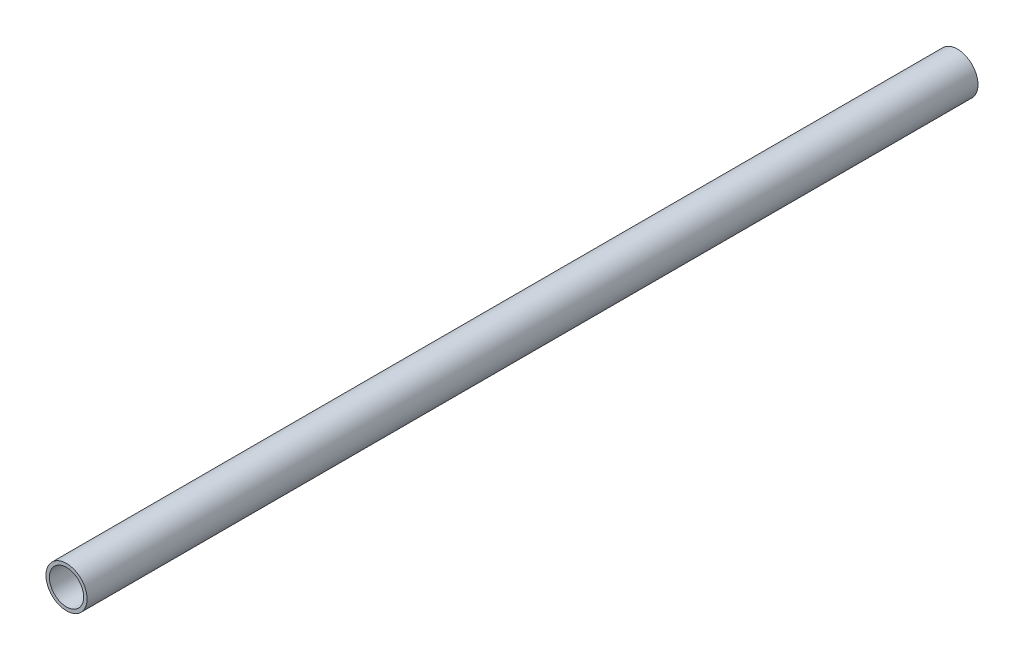
ISO-10303-21;
HEADER;
FILE_DESCRIPTION(('STEP AP214'),'2;1');
FILE_NAME('part.step','',(''),(''),'','','');
FILE_SCHEMA(('AUTOMOTIVE_DESIGN { 1 0 10303 214 1 1 1 1 }'));
ENDSEC;
DATA;
#1=APPLICATION_CONTEXT('core data for automotive mechanical design processes');
#2=APPLICATION_PROTOCOL_DEFINITION('international standard','automotive_design',2000,#1);
#3=PRODUCT_CONTEXT('',#1,'mechanical');
#4=PRODUCT('Part','Part','',(#3));
#5=PRODUCT_RELATED_PRODUCT_CATEGORY('part','',(#4));
#6=PRODUCT_DEFINITION_FORMATION('','',#4);
#7=PRODUCT_DEFINITION_CONTEXT('part definition',#1,'design');
#8=PRODUCT_DEFINITION('design','',#6,#7);
#9=PRODUCT_DEFINITION_SHAPE('','',#8);
#10=(LENGTH_UNIT() NAMED_UNIT(*) SI_UNIT(.MILLI.,.METRE.));
#11=(NAMED_UNIT(*) PLANE_ANGLE_UNIT() SI_UNIT($,.RADIAN.));
#12=(NAMED_UNIT(*) SI_UNIT($,.STERADIAN.) SOLID_ANGLE_UNIT());
#13=UNCERTAINTY_MEASURE_WITH_UNIT(LENGTH_MEASURE(1.E-05),#10,'distance_accuracy_value','');
#14=(GEOMETRIC_REPRESENTATION_CONTEXT(3) GLOBAL_UNCERTAINTY_ASSIGNED_CONTEXT((#13)) GLOBAL_UNIT_ASSIGNED_CONTEXT((#10,
#11,#12)) REPRESENTATION_CONTEXT('',''));
#15=CARTESIAN_POINT('',(0.,0.,0.));
#16=DIRECTION('',(0.,0.,1.));
#17=DIRECTION('',(1.,0.,0.));
#18=AXIS2_PLACEMENT_3D('',#15,#16,#17);
#19=CARTESIAN_POINT('',(0.,0.,520.));
#20=DIRECTION('',(0.,0.,1.));
#21=DIRECTION('',(1.,0.,0.));
#22=AXIS2_PLACEMENT_3D('',#19,#20,#21);
#23=PLANE('',#22);
#24=CARTESIAN_POINT('',(0.,0.,520.));
#25=DIRECTION('',(0.,0.,1.));
#26=DIRECTION('',(1.,0.,0.));
#27=AXIS2_PLACEMENT_3D('',#24,#25,#26);
#28=CIRCLE('',#27,12.);
#29=CARTESIAN_POINT('',(12.,0.,520.));
#30=VERTEX_POINT('',#29);
#31=EDGE_CURVE('E10',#30,#30,#28,.T.);
#32=ORIENTED_EDGE('',*,*,#31,.T.);
#33=EDGE_LOOP('',(#32));
#34=FACE_BOUND('',#33,.T.);
#35=CARTESIAN_POINT('',(0.,0.,520.));
#36=DIRECTION('',(0.,0.,1.));
#37=DIRECTION('',(1.,0.,0.));
#38=AXIS2_PLACEMENT_3D('',#35,#36,#37);
#39=CIRCLE('',#38,10.);
#40=CARTESIAN_POINT('',(10.,0.,520.));
#41=VERTEX_POINT('',#40);
#42=EDGE_CURVE('E48',#41,#41,#39,.T.);
#43=ORIENTED_EDGE('',*,*,#42,.F.);
#44=EDGE_LOOP('',(#43));
#45=FACE_BOUND('',#44,.T.);
#46=ADVANCED_FACE('F40',(#34,#45),#23,.T.);
#47=CARTESIAN_POINT('',(0.,0.,0.));
#48=DIRECTION('',(0.,0.,1.));
#49=DIRECTION('',(1.,0.,0.));
#50=AXIS2_PLACEMENT_3D('',#47,#48,#49);
#51=PLANE('',#50);
#52=CARTESIAN_POINT('',(0.,0.,0.));
#53=DIRECTION('',(0.,0.,1.));
#54=DIRECTION('',(1.,0.,0.));
#55=AXIS2_PLACEMENT_3D('',#52,#53,#54);
#56=CIRCLE('',#55,12.);
#57=CARTESIAN_POINT('',(12.,0.,0.));
#58=VERTEX_POINT('',#57);
#59=EDGE_CURVE('E41',#58,#58,#56,.T.);
#60=ORIENTED_EDGE('',*,*,#59,.F.);
#61=EDGE_LOOP('',(#60));
#62=FACE_BOUND('',#61,.T.);
#63=CARTESIAN_POINT('',(0.,0.,0.));
#64=DIRECTION('',(0.,0.,1.));
#65=DIRECTION('',(1.,0.,0.));
#66=AXIS2_PLACEMENT_3D('',#63,#64,#65);
#67=CIRCLE('',#66,10.);
#68=CARTESIAN_POINT('',(10.,0.,0.));
#69=VERTEX_POINT('',#68);
#70=EDGE_CURVE('E49',#69,#69,#67,.T.);
#71=ORIENTED_EDGE('',*,*,#70,.T.);
#72=EDGE_LOOP('',(#71));
#73=FACE_BOUND('',#72,.T.);
#74=ADVANCED_FACE('F58',(#62,#73),#51,.F.);
#75=CARTESIAN_POINT('',(0.,0.,520.));
#76=DIRECTION('',(0.,0.,-1.));
#77=DIRECTION('',(-1.,0.,0.));
#78=AXIS2_PLACEMENT_3D('',#75,#76,#77);
#79=CYLINDRICAL_SURFACE('',#78,12.);
#80=ORIENTED_EDGE('',*,*,#31,.F.);
#81=EDGE_LOOP('',(#80));
#82=FACE_BOUND('',#81,.T.);
#83=ORIENTED_EDGE('',*,*,#59,.T.);
#84=EDGE_LOOP('',(#83));
#85=FACE_BOUND('',#84,.T.);
#86=ADVANCED_FACE('F39',(#82,#85),#79,.T.);
#87=CARTESIAN_POINT('',(0.,0.,520.));
#88=DIRECTION('',(0.,0.,-1.));
#89=DIRECTION('',(-1.,0.,0.));
#90=AXIS2_PLACEMENT_3D('',#87,#88,#89);
#91=CYLINDRICAL_SURFACE('',#90,10.);
#92=ORIENTED_EDGE('',*,*,#42,.T.);
#93=EDGE_LOOP('',(#92));
#94=FACE_BOUND('',#93,.T.);
#95=ORIENTED_EDGE('',*,*,#70,.F.);
#96=EDGE_LOOP('',(#95));
#97=FACE_BOUND('',#96,.T.);
#98=ADVANCED_FACE('F57',(#94,#97),#91,.F.);
#99=CLOSED_SHELL('',(#46,#74,#86,#98));
#100=MANIFOLD_SOLID_BREP('B2',#99);
#101=ADVANCED_BREP_SHAPE_REPRESENTATION('',(#18,#100),#14);
#102=SHAPE_DEFINITION_REPRESENTATION(#9,#101);
ENDSEC;
END-ISO-10303-21;
